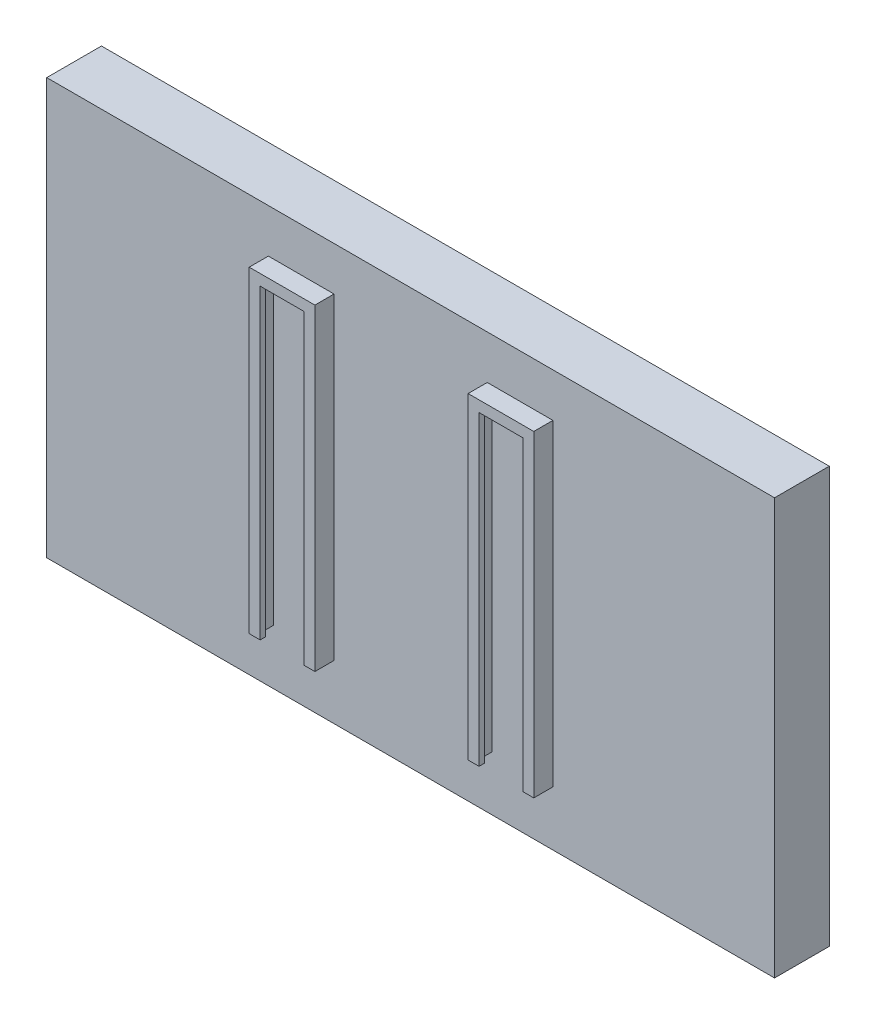
ISO-10303-21;
HEADER;
FILE_DESCRIPTION(('STEP AP214'),'2;1');
FILE_NAME('part.step','',(''),(''),'','','');
FILE_SCHEMA(('AUTOMOTIVE_DESIGN { 1 0 10303 214 1 1 1 1 }'));
ENDSEC;
DATA;
#1=APPLICATION_CONTEXT('core data for automotive mechanical design processes');
#2=APPLICATION_PROTOCOL_DEFINITION('international standard','automotive_design',2000,#1);
#3=PRODUCT_CONTEXT('',#1,'mechanical');
#4=PRODUCT('Part','Part','',(#3));
#5=PRODUCT_RELATED_PRODUCT_CATEGORY('part','',(#4));
#6=PRODUCT_DEFINITION_FORMATION('','',#4);
#7=PRODUCT_DEFINITION_CONTEXT('part definition',#1,'design');
#8=PRODUCT_DEFINITION('design','',#6,#7);
#9=PRODUCT_DEFINITION_SHAPE('','',#8);
#10=(LENGTH_UNIT() NAMED_UNIT(*) SI_UNIT(.MILLI.,.METRE.));
#11=(NAMED_UNIT(*) PLANE_ANGLE_UNIT() SI_UNIT($,.RADIAN.));
#12=(NAMED_UNIT(*) SI_UNIT($,.STERADIAN.) SOLID_ANGLE_UNIT());
#13=UNCERTAINTY_MEASURE_WITH_UNIT(LENGTH_MEASURE(1.E-05),#10,'distance_accuracy_value','');
#14=(GEOMETRIC_REPRESENTATION_CONTEXT(3) GLOBAL_UNCERTAINTY_ASSIGNED_CONTEXT((#13)) GLOBAL_UNIT_ASSIGNED_CONTEXT((#10,
#11,#12)) REPRESENTATION_CONTEXT('',''));
#15=CARTESIAN_POINT('',(0.,0.,0.));
#16=DIRECTION('',(0.,0.,1.));
#17=DIRECTION('',(1.,0.,0.));
#18=AXIS2_PLACEMENT_3D('',#15,#16,#17);
#19=CARTESIAN_POINT('',(0.,0.,10.));
#20=DIRECTION('',(0.,0.,1.));
#21=DIRECTION('',(1.,0.,0.));
#22=AXIS2_PLACEMENT_3D('',#19,#20,#21);
#23=PLANE('',#22);
#24=DIRECTION('',(0.,-1.,0.));
#25=VECTOR('',#24,1.);
#26=CARTESIAN_POINT('',(25.1,66.,10.));
#27=LINE('',#26,#25);
#28=CARTESIAN_POINT('',(25.1,66.,10.));
#29=VERTEX_POINT('',#28);
#30=CARTESIAN_POINT('',(25.1,10.,10.));
#31=VERTEX_POINT('',#30);
#32=EDGE_CURVE('E48',#29,#31,#27,.T.);
#33=ORIENTED_EDGE('',*,*,#32,.F.);
#34=DIRECTION('',(-1.,0.,0.));
#35=VECTOR('',#34,1.);
#36=CARTESIAN_POINT('',(0.,66.,10.));
#37=LINE('',#36,#35);
#38=CARTESIAN_POINT('',(14.9,66.,10.));
#39=VERTEX_POINT('',#38);
#40=EDGE_CURVE('E347',#29,#39,#37,.T.);
#41=ORIENTED_EDGE('',*,*,#40,.T.);
#42=DIRECTION('',(0.,1.,0.));
#43=VECTOR('',#42,1.);
#44=CARTESIAN_POINT('',(14.9,66.,10.));
#45=LINE('',#44,#43);
#46=CARTESIAN_POINT('',(14.9,10.,9.99999999999999));
#47=VERTEX_POINT('',#46);
#48=EDGE_CURVE('E277',#47,#39,#45,.T.);
#49=ORIENTED_EDGE('',*,*,#48,.F.);
#50=DIRECTION('',(-1.,0.,0.));
#51=VECTOR('',#50,1.);
#52=CARTESIAN_POINT('',(0.,10.,10.));
#53=LINE('',#52,#51);
#54=CARTESIAN_POINT('',(14.,10.,10.));
#55=VERTEX_POINT('',#54);
#56=EDGE_CURVE('E322',#47,#55,#53,.T.);
#57=ORIENTED_EDGE('',*,*,#56,.T.);
#58=DIRECTION('',(0.,-1.,0.));
#59=VECTOR('',#58,1.);
#60=CARTESIAN_POINT('',(14.,0.,10.));
#61=LINE('',#60,#59);
#62=CARTESIAN_POINT('',(14.,68.,10.));
#63=VERTEX_POINT('',#62);
#64=EDGE_CURVE('E328',#63,#55,#61,.T.);
#65=ORIENTED_EDGE('',*,*,#64,.F.);
#66=DIRECTION('',(-1.,0.,0.));
#67=VECTOR('',#66,1.);
#68=CARTESIAN_POINT('',(0.,68.,10.));
#69=LINE('',#68,#67);
#70=CARTESIAN_POINT('',(26.,68.,10.));
#71=VERTEX_POINT('',#70);
#72=EDGE_CURVE('E353',#71,#63,#69,.T.);
#73=ORIENTED_EDGE('',*,*,#72,.F.);
#74=DIRECTION('',(0.,1.,0.));
#75=VECTOR('',#74,1.);
#76=CARTESIAN_POINT('',(26.,0.,10.));
#77=LINE('',#76,#75);
#78=CARTESIAN_POINT('',(26.,10.,10.));
#79=VERTEX_POINT('',#78);
#80=EDGE_CURVE('E351',#79,#71,#77,.T.);
#81=ORIENTED_EDGE('',*,*,#80,.F.);
#82=DIRECTION('',(-1.,0.,0.));
#83=VECTOR('',#82,1.);
#84=CARTESIAN_POINT('',(0.,10.,10.));
#85=LINE('',#84,#83);
#86=EDGE_CURVE('E349',#79,#31,#85,.T.);
#87=ORIENTED_EDGE('',*,*,#86,.T.);
#88=EDGE_LOOP('',(#33,#41,#49,#57,#65,#73,#81,#87));
#89=FACE_BOUND('',#88,.T.);
#90=DIRECTION('',(0.,-1.,0.));
#91=VECTOR('',#90,1.);
#92=CARTESIAN_POINT('',(-66.5,76.,10.));
#93=LINE('',#92,#91);
#94=CARTESIAN_POINT('',(-66.5,76.,10.));
#95=VERTEX_POINT('',#94);
#96=CARTESIAN_POINT('',(-66.5,0.,10.));
#97=VERTEX_POINT('',#96);
#98=EDGE_CURVE('E466',#95,#97,#93,.T.);
#99=ORIENTED_EDGE('',*,*,#98,.T.);
#100=DIRECTION('',(1.,0.,0.));
#101=VECTOR('',#100,1.);
#102=CARTESIAN_POINT('',(-66.5,0.,10.));
#103=LINE('',#102,#101);
#104=CARTESIAN_POINT('',(66.5,0.,10.));
#105=VERTEX_POINT('',#104);
#106=EDGE_CURVE('E469',#97,#105,#103,.T.);
#107=ORIENTED_EDGE('',*,*,#106,.T.);
#108=DIRECTION('',(0.,1.,0.));
#109=VECTOR('',#108,1.);
#110=CARTESIAN_POINT('',(66.5,76.,10.));
#111=LINE('',#110,#109);
#112=CARTESIAN_POINT('',(66.5,76.,10.));
#113=VERTEX_POINT('',#112);
#114=EDGE_CURVE('E472',#105,#113,#111,.T.);
#115=ORIENTED_EDGE('',*,*,#114,.T.);
#116=DIRECTION('',(-1.,0.,0.));
#117=VECTOR('',#116,1.);
#118=CARTESIAN_POINT('',(-66.5,76.,10.));
#119=LINE('',#118,#117);
#120=EDGE_CURVE('E474',#113,#95,#119,.T.);
#121=ORIENTED_EDGE('',*,*,#120,.T.);
#122=EDGE_LOOP('',(#99,#107,#115,#121));
#123=FACE_BOUND('',#122,.T.);
#124=DIRECTION('',(0.,-1.,0.));
#125=VECTOR('',#124,1.);
#126=CARTESIAN_POINT('',(-14.9,66.,10.));
#127=LINE('',#126,#125);
#128=CARTESIAN_POINT('',(-14.9,66.,10.));
#129=VERTEX_POINT('',#128);
#130=CARTESIAN_POINT('',(-14.9,10.,10.));
#131=VERTEX_POINT('',#130);
#132=EDGE_CURVE('E56',#129,#131,#127,.T.);
#133=ORIENTED_EDGE('',*,*,#132,.F.);
#134=DIRECTION('',(1.,0.,0.));
#135=VECTOR('',#134,1.);
#136=CARTESIAN_POINT('',(0.,66.,10.));
#137=LINE('',#136,#135);
#138=CARTESIAN_POINT('',(-25.1,66.,10.));
#139=VERTEX_POINT('',#138);
#140=EDGE_CURVE('E377',#139,#129,#137,.T.);
#141=ORIENTED_EDGE('',*,*,#140,.F.);
#142=DIRECTION('',(0.,1.,0.));
#143=VECTOR('',#142,1.);
#144=CARTESIAN_POINT('',(-25.1,66.,10.));
#145=LINE('',#144,#143);
#146=CARTESIAN_POINT('',(-25.1,10.,9.99999999999999));
#147=VERTEX_POINT('',#146);
#148=EDGE_CURVE('E305',#147,#139,#145,.T.);
#149=ORIENTED_EDGE('',*,*,#148,.F.);
#150=DIRECTION('',(1.,0.,0.));
#151=VECTOR('',#150,1.);
#152=CARTESIAN_POINT('',(0.,10.,10.));
#153=LINE('',#152,#151);
#154=CARTESIAN_POINT('',(-26.,10.,10.));
#155=VERTEX_POINT('',#154);
#156=EDGE_CURVE('E382',#155,#147,#153,.T.);
#157=ORIENTED_EDGE('',*,*,#156,.F.);
#158=DIRECTION('',(0.,1.,0.));
#159=VECTOR('',#158,1.);
#160=CARTESIAN_POINT('',(-26.,0.,10.));
#161=LINE('',#160,#159);
#162=CARTESIAN_POINT('',(-26.,68.,10.));
#163=VERTEX_POINT('',#162);
#164=EDGE_CURVE('E408',#155,#163,#161,.T.);
#165=ORIENTED_EDGE('',*,*,#164,.T.);
#166=DIRECTION('',(1.,0.,0.));
#167=VECTOR('',#166,1.);
#168=CARTESIAN_POINT('',(0.,68.,10.));
#169=LINE('',#168,#167);
#170=CARTESIAN_POINT('',(-14.,68.,10.));
#171=VERTEX_POINT('',#170);
#172=EDGE_CURVE('E405',#163,#171,#169,.T.);
#173=ORIENTED_EDGE('',*,*,#172,.T.);
#174=DIRECTION('',(0.,1.,0.));
#175=VECTOR('',#174,1.);
#176=CARTESIAN_POINT('',(-14.,0.,10.));
#177=LINE('',#176,#175);
#178=CARTESIAN_POINT('',(-14.,10.,10.));
#179=VERTEX_POINT('',#178);
#180=EDGE_CURVE('E402',#179,#171,#177,.T.);
#181=ORIENTED_EDGE('',*,*,#180,.F.);
#182=DIRECTION('',(1.,0.,0.));
#183=VECTOR('',#182,1.);
#184=CARTESIAN_POINT('',(0.,10.,10.));
#185=LINE('',#184,#183);
#186=EDGE_CURVE('E400',#131,#179,#185,.T.);
#187=ORIENTED_EDGE('',*,*,#186,.F.);
#188=EDGE_LOOP('',(#133,#141,#149,#157,#165,#173,#181,#187));
#189=FACE_BOUND('',#188,.T.);
#190=ADVANCED_FACE('F33',(#89,#123,#189),#23,.T.);
#191=CARTESIAN_POINT('',(-66.5,76.,10.));
#192=DIRECTION('',(1.,0.,0.));
#193=DIRECTION('',(0.,0.,-1.));
#194=AXIS2_PLACEMENT_3D('',#191,#192,#193);
#195=PLANE('',#194);
#196=DIRECTION('',(0.,-1.,0.));
#197=VECTOR('',#196,1.);
#198=CARTESIAN_POINT('',(-66.5,76.,0.));
#199=LINE('',#198,#197);
#200=CARTESIAN_POINT('',(-66.5,76.,0.));
#201=VERTEX_POINT('',#200);
#202=CARTESIAN_POINT('',(-66.5,0.,0.));
#203=VERTEX_POINT('',#202);
#204=EDGE_CURVE('E459',#201,#203,#199,.T.);
#205=ORIENTED_EDGE('',*,*,#204,.T.);
#206=DIRECTION('',(0.,0.,-1.));
#207=VECTOR('',#206,1.);
#208=CARTESIAN_POINT('',(-66.5,0.,10.));
#209=LINE('',#208,#207);
#210=EDGE_CURVE('E11',#97,#203,#209,.T.);
#211=ORIENTED_EDGE('',*,*,#210,.F.);
#212=ORIENTED_EDGE('',*,*,#98,.F.);
#213=DIRECTION('',(0.,0.,-1.));
#214=VECTOR('',#213,1.);
#215=CARTESIAN_POINT('',(-66.5,76.,10.));
#216=LINE('',#215,#214);
#217=EDGE_CURVE('E476',#95,#201,#216,.T.);
#218=ORIENTED_EDGE('',*,*,#217,.T.);
#219=EDGE_LOOP('',(#205,#211,#212,#218));
#220=FACE_BOUND('',#219,.T.);
#221=ADVANCED_FACE('F35',(#220),#195,.F.);
#222=CARTESIAN_POINT('',(-66.5,0.,10.));
#223=DIRECTION('',(0.,1.,0.));
#224=DIRECTION('',(0.,0.,1.));
#225=AXIS2_PLACEMENT_3D('',#222,#223,#224);
#226=PLANE('',#225);
#227=DIRECTION('',(1.,0.,0.));
#228=VECTOR('',#227,1.);
#229=CARTESIAN_POINT('',(-66.5,0.,0.));
#230=LINE('',#229,#228);
#231=CARTESIAN_POINT('',(66.5,0.,0.));
#232=VERTEX_POINT('',#231);
#233=EDGE_CURVE('E479',#203,#232,#230,.T.);
#234=ORIENTED_EDGE('',*,*,#233,.T.);
#235=DIRECTION('',(0.,0.,-1.));
#236=VECTOR('',#235,1.);
#237=CARTESIAN_POINT('',(66.5,0.,10.));
#238=LINE('',#237,#236);
#239=EDGE_CURVE('E41',#105,#232,#238,.T.);
#240=ORIENTED_EDGE('',*,*,#239,.F.);
#241=ORIENTED_EDGE('',*,*,#106,.F.);
#242=ORIENTED_EDGE('',*,*,#210,.T.);
#243=EDGE_LOOP('',(#234,#240,#241,#242));
#244=FACE_BOUND('',#243,.T.);
#245=ADVANCED_FACE('F509',(#244),#226,.F.);
#246=CARTESIAN_POINT('',(66.5,76.,10.));
#247=DIRECTION('',(-1.,0.,0.));
#248=DIRECTION('',(0.,-1.,0.));
#249=AXIS2_PLACEMENT_3D('',#246,#247,#248);
#250=PLANE('',#249);
#251=DIRECTION('',(0.,1.,0.));
#252=VECTOR('',#251,1.);
#253=CARTESIAN_POINT('',(66.5,76.,0.));
#254=LINE('',#253,#252);
#255=CARTESIAN_POINT('',(66.5,76.,0.));
#256=VERTEX_POINT('',#255);
#257=EDGE_CURVE('E481',#232,#256,#254,.T.);
#258=ORIENTED_EDGE('',*,*,#257,.T.);
#259=DIRECTION('',(0.,0.,-1.));
#260=VECTOR('',#259,1.);
#261=CARTESIAN_POINT('',(66.5,76.,10.));
#262=LINE('',#261,#260);
#263=EDGE_CURVE('E486',#113,#256,#262,.T.);
#264=ORIENTED_EDGE('',*,*,#263,.F.);
#265=ORIENTED_EDGE('',*,*,#114,.F.);
#266=ORIENTED_EDGE('',*,*,#239,.T.);
#267=EDGE_LOOP('',(#258,#264,#265,#266));
#268=FACE_BOUND('',#267,.T.);
#269=ADVANCED_FACE('F493',(#268),#250,.F.);
#270=CARTESIAN_POINT('',(-66.5,76.,10.));
#271=DIRECTION('',(0.,-1.,0.));
#272=DIRECTION('',(1.,0.,0.));
#273=AXIS2_PLACEMENT_3D('',#270,#271,#272);
#274=PLANE('',#273);
#275=DIRECTION('',(-1.,0.,0.));
#276=VECTOR('',#275,1.);
#277=CARTESIAN_POINT('',(-66.5,76.,0.));
#278=LINE('',#277,#276);
#279=EDGE_CURVE('E470',#256,#201,#278,.T.);
#280=ORIENTED_EDGE('',*,*,#279,.T.);
#281=ORIENTED_EDGE('',*,*,#217,.F.);
#282=ORIENTED_EDGE('',*,*,#120,.F.);
#283=ORIENTED_EDGE('',*,*,#263,.T.);
#284=EDGE_LOOP('',(#280,#281,#282,#283));
#285=FACE_BOUND('',#284,.T.);
#286=ADVANCED_FACE('F502',(#285),#274,.F.);
#287=CARTESIAN_POINT('',(0.,0.,0.));
#288=DIRECTION('',(0.,0.,1.));
#289=DIRECTION('',(1.,0.,0.));
#290=AXIS2_PLACEMENT_3D('',#287,#288,#289);
#291=PLANE('',#290);
#292=DIRECTION('',(-1.,0.,0.));
#293=VECTOR('',#292,1.);
#294=CARTESIAN_POINT('',(55.,5.49999999999998,0.));
#295=LINE('',#294,#293);
#296=CARTESIAN_POINT('',(55.,5.49999999999998,0.));
#297=VERTEX_POINT('',#296);
#298=CARTESIAN_POINT('',(-55.,5.49999999999998,0.));
#299=VERTEX_POINT('',#298);
#300=EDGE_CURVE('E449',#297,#299,#295,.T.);
#301=ORIENTED_EDGE('',*,*,#300,.F.);
#302=DIRECTION('',(0.,-1.,0.));
#303=VECTOR('',#302,1.);
#304=CARTESIAN_POINT('',(55.,70.5,0.));
#305=LINE('',#304,#303);
#306=CARTESIAN_POINT('',(55.,70.5,0.));
#307=VERTEX_POINT('',#306);
#308=EDGE_CURVE('E433',#307,#297,#305,.T.);
#309=ORIENTED_EDGE('',*,*,#308,.F.);
#310=DIRECTION('',(1.,0.,0.));
#311=VECTOR('',#310,1.);
#312=CARTESIAN_POINT('',(55.,70.5,0.));
#313=LINE('',#312,#311);
#314=CARTESIAN_POINT('',(-55.,70.5,0.));
#315=VERTEX_POINT('',#314);
#316=EDGE_CURVE('E438',#315,#307,#313,.T.);
#317=ORIENTED_EDGE('',*,*,#316,.F.);
#318=DIRECTION('',(0.,1.,0.));
#319=VECTOR('',#318,1.);
#320=CARTESIAN_POINT('',(-55.,70.5,0.));
#321=LINE('',#320,#319);
#322=EDGE_CURVE('E452',#299,#315,#321,.T.);
#323=ORIENTED_EDGE('',*,*,#322,.F.);
#324=EDGE_LOOP('',(#301,#309,#317,#323));
#325=FACE_BOUND('',#324,.T.);
#326=ORIENTED_EDGE('',*,*,#204,.F.);
#327=ORIENTED_EDGE('',*,*,#279,.F.);
#328=ORIENTED_EDGE('',*,*,#257,.F.);
#329=ORIENTED_EDGE('',*,*,#233,.F.);
#330=EDGE_LOOP('',(#326,#327,#328,#329));
#331=FACE_BOUND('',#330,.T.);
#332=ADVANCED_FACE('F499',(#325,#331),#291,.F.);
#333=CARTESIAN_POINT('',(55.,70.5,2.));
#334=DIRECTION('',(1.,0.,0.));
#335=DIRECTION('',(0.,1.,0.));
#336=AXIS2_PLACEMENT_3D('',#333,#334,#335);
#337=PLANE('',#336);
#338=ORIENTED_EDGE('',*,*,#308,.T.);
#339=DIRECTION('',(0.,0.,-1.));
#340=VECTOR('',#339,1.);
#341=CARTESIAN_POINT('',(55.,5.49999999999998,2.));
#342=LINE('',#341,#340);
#343=CARTESIAN_POINT('',(55.,5.49999999999998,2.));
#344=VERTEX_POINT('',#343);
#345=EDGE_CURVE('E447',#344,#297,#342,.T.);
#346=ORIENTED_EDGE('',*,*,#345,.F.);
#347=DIRECTION('',(0.,-1.,0.));
#348=VECTOR('',#347,1.);
#349=CARTESIAN_POINT('',(55.,70.5,2.));
#350=LINE('',#349,#348);
#351=CARTESIAN_POINT('',(55.,70.5,2.));
#352=VERTEX_POINT('',#351);
#353=EDGE_CURVE('E434',#352,#344,#350,.T.);
#354=ORIENTED_EDGE('',*,*,#353,.F.);
#355=DIRECTION('',(0.,0.,-1.));
#356=VECTOR('',#355,1.);
#357=CARTESIAN_POINT('',(55.,70.5,2.));
#358=LINE('',#357,#356);
#359=EDGE_CURVE('E457',#352,#307,#358,.T.);
#360=ORIENTED_EDGE('',*,*,#359,.T.);
#361=EDGE_LOOP('',(#338,#346,#354,#360));
#362=FACE_BOUND('',#361,.T.);
#363=ADVANCED_FACE('F525',(#362),#337,.F.);
#364=CARTESIAN_POINT('',(55.,70.5,2.));
#365=DIRECTION('',(0.,1.,0.));
#366=DIRECTION('',(0.,0.,1.));
#367=AXIS2_PLACEMENT_3D('',#364,#365,#366);
#368=PLANE('',#367);
#369=ORIENTED_EDGE('',*,*,#316,.T.);
#370=ORIENTED_EDGE('',*,*,#359,.F.);
#371=DIRECTION('',(1.,0.,0.));
#372=VECTOR('',#371,1.);
#373=CARTESIAN_POINT('',(55.,70.5,2.));
#374=LINE('',#373,#372);
#375=CARTESIAN_POINT('',(-55.,70.5,2.));
#376=VERTEX_POINT('',#375);
#377=EDGE_CURVE('E444',#376,#352,#374,.T.);
#378=ORIENTED_EDGE('',*,*,#377,.F.);
#379=DIRECTION('',(0.,0.,-1.));
#380=VECTOR('',#379,1.);
#381=CARTESIAN_POINT('',(-55.,70.5,2.));
#382=LINE('',#381,#380);
#383=EDGE_CURVE('E460',#376,#315,#382,.T.);
#384=ORIENTED_EDGE('',*,*,#383,.T.);
#385=EDGE_LOOP('',(#369,#370,#378,#384));
#386=FACE_BOUND('',#385,.T.);
#387=ADVANCED_FACE('F545',(#386),#368,.F.);
#388=CARTESIAN_POINT('',(-55.,70.5,2.));
#389=DIRECTION('',(-1.,0.,0.));
#390=DIRECTION('',(0.,-1.,0.));
#391=AXIS2_PLACEMENT_3D('',#388,#389,#390);
#392=PLANE('',#391);
#393=ORIENTED_EDGE('',*,*,#322,.T.);
#394=ORIENTED_EDGE('',*,*,#383,.F.);
#395=DIRECTION('',(0.,1.,0.));
#396=VECTOR('',#395,1.);
#397=CARTESIAN_POINT('',(-55.,70.5,2.));
#398=LINE('',#397,#396);
#399=CARTESIAN_POINT('',(-55.,5.49999999999998,2.));
#400=VERTEX_POINT('',#399);
#401=EDGE_CURVE('E441',#400,#376,#398,.T.);
#402=ORIENTED_EDGE('',*,*,#401,.F.);
#403=DIRECTION('',(0.,0.,-1.));
#404=VECTOR('',#403,1.);
#405=CARTESIAN_POINT('',(-55.,5.49999999999998,2.));
#406=LINE('',#405,#404);
#407=EDGE_CURVE('E462',#400,#299,#406,.T.);
#408=ORIENTED_EDGE('',*,*,#407,.T.);
#409=EDGE_LOOP('',(#393,#394,#402,#408));
#410=FACE_BOUND('',#409,.T.);
#411=ADVANCED_FACE('F552',(#410),#392,.F.);
#412=CARTESIAN_POINT('',(55.,5.49999999999998,2.));
#413=DIRECTION('',(0.,-1.,0.));
#414=DIRECTION('',(0.,0.,-1.));
#415=AXIS2_PLACEMENT_3D('',#412,#413,#414);
#416=PLANE('',#415);
#417=ORIENTED_EDGE('',*,*,#300,.T.);
#418=ORIENTED_EDGE('',*,*,#407,.F.);
#419=DIRECTION('',(-1.,0.,0.));
#420=VECTOR('',#419,1.);
#421=CARTESIAN_POINT('',(55.,5.49999999999998,2.));
#422=LINE('',#421,#420);
#423=EDGE_CURVE('E437',#344,#400,#422,.T.);
#424=ORIENTED_EDGE('',*,*,#423,.F.);
#425=ORIENTED_EDGE('',*,*,#345,.T.);
#426=EDGE_LOOP('',(#417,#418,#424,#425));
#427=FACE_BOUND('',#426,.T.);
#428=ADVANCED_FACE('F560',(#427),#416,.F.);
#429=CARTESIAN_POINT('',(0.,0.,2.));
#430=DIRECTION('',(0.,0.,-1.));
#431=DIRECTION('',(-1.,0.,0.));
#432=AXIS2_PLACEMENT_3D('',#429,#430,#431);
#433=PLANE('',#432);
#434=ORIENTED_EDGE('',*,*,#353,.T.);
#435=ORIENTED_EDGE('',*,*,#423,.T.);
#436=ORIENTED_EDGE('',*,*,#401,.T.);
#437=ORIENTED_EDGE('',*,*,#377,.T.);
#438=EDGE_LOOP('',(#434,#435,#436,#437));
#439=FACE_BOUND('',#438,.T.);
#440=ADVANCED_FACE('F567',(#439),#433,.T.);
#441=CARTESIAN_POINT('',(0.,66.,13.5));
#442=DIRECTION('',(0.,1.,0.));
#443=DIRECTION('',(0.,0.,1.));
#444=AXIS2_PLACEMENT_3D('',#441,#442,#443);
#445=PLANE('',#444);
#446=ORIENTED_EDGE('',*,*,#140,.T.);
#447=DIRECTION('',(0.,0.,-1.));
#448=VECTOR('',#447,1.);
#449=CARTESIAN_POINT('',(-14.9,66.,10.));
#450=LINE('',#449,#448);
#451=CARTESIAN_POINT('',(-14.9,66.,12.5));
#452=VERTEX_POINT('',#451);
#453=EDGE_CURVE('E296',#452,#129,#450,.T.);
#454=ORIENTED_EDGE('',*,*,#453,.F.);
#455=DIRECTION('',(-1.,0.,0.));
#456=VECTOR('',#455,1.);
#457=CARTESIAN_POINT('',(-14.9,66.,12.5));
#458=LINE('',#457,#456);
#459=CARTESIAN_POINT('',(-16.,66.,12.5));
#460=VERTEX_POINT('',#459);
#461=EDGE_CURVE('E301',#452,#460,#458,.T.);
#462=ORIENTED_EDGE('',*,*,#461,.T.);
#463=DIRECTION('',(0.,0.,-1.));
#464=VECTOR('',#463,1.);
#465=CARTESIAN_POINT('',(-16.,66.,13.5));
#466=LINE('',#465,#464);
#467=CARTESIAN_POINT('',(-16.,66.,13.5));
#468=VERTEX_POINT('',#467);
#469=EDGE_CURVE('E430',#468,#460,#466,.T.);
#470=ORIENTED_EDGE('',*,*,#469,.F.);
#471=DIRECTION('',(1.,0.,0.));
#472=VECTOR('',#471,1.);
#473=CARTESIAN_POINT('',(0.,66.,13.5));
#474=LINE('',#473,#472);
#475=CARTESIAN_POINT('',(-24.,66.,13.5));
#476=VERTEX_POINT('',#475);
#477=EDGE_CURVE('E378',#476,#468,#474,.T.);
#478=ORIENTED_EDGE('',*,*,#477,.F.);
#479=DIRECTION('',(0.,0.,-1.));
#480=VECTOR('',#479,1.);
#481=CARTESIAN_POINT('',(-24.,66.,13.5));
#482=LINE('',#481,#480);
#483=CARTESIAN_POINT('',(-24.,66.,12.5));
#484=VERTEX_POINT('',#483);
#485=EDGE_CURVE('E398',#476,#484,#482,.T.);
#486=ORIENTED_EDGE('',*,*,#485,.T.);
#487=DIRECTION('',(1.,0.,0.));
#488=VECTOR('',#487,1.);
#489=CARTESIAN_POINT('',(-25.1,66.,12.5));
#490=LINE('',#489,#488);
#491=CARTESIAN_POINT('',(-25.1,66.,12.5));
#492=VERTEX_POINT('',#491);
#493=EDGE_CURVE('E317',#492,#484,#490,.T.);
#494=ORIENTED_EDGE('',*,*,#493,.F.);
#495=DIRECTION('',(0.,0.,1.));
#496=VECTOR('',#495,1.);
#497=CARTESIAN_POINT('',(-25.1,66.,10.));
#498=LINE('',#497,#496);
#499=EDGE_CURVE('E308',#139,#492,#498,.T.);
#500=ORIENTED_EDGE('',*,*,#499,.F.);
#501=EDGE_LOOP('',(#446,#454,#462,#470,#478,#486,#494,#500));
#502=FACE_BOUND('',#501,.T.);
#503=ADVANCED_FACE('F573',(#502),#445,.F.);
#504=CARTESIAN_POINT('',(-16.,0.,13.5));
#505=DIRECTION('',(1.,0.,0.));
#506=DIRECTION('',(0.,1.,0.));
#507=AXIS2_PLACEMENT_3D('',#504,#505,#506);
#508=PLANE('',#507);
#509=ORIENTED_EDGE('',*,*,#469,.T.);
#510=DIRECTION('',(0.,1.,0.));
#511=VECTOR('',#510,1.);
#512=CARTESIAN_POINT('',(-16.,66.,12.5));
#513=LINE('',#512,#511);
#514=CARTESIAN_POINT('',(-16.,10.,12.5));
#515=VERTEX_POINT('',#514);
#516=EDGE_CURVE('E287',#515,#460,#513,.T.);
#517=ORIENTED_EDGE('',*,*,#516,.F.);
#518=DIRECTION('',(0.,0.,-1.));
#519=VECTOR('',#518,1.);
#520=CARTESIAN_POINT('',(-16.,10.,13.5));
#521=LINE('',#520,#519);
#522=CARTESIAN_POINT('',(-16.,10.,13.5));
#523=VERTEX_POINT('',#522);
#524=EDGE_CURVE('E427',#523,#515,#521,.T.);
#525=ORIENTED_EDGE('',*,*,#524,.F.);
#526=DIRECTION('',(0.,-1.,0.));
#527=VECTOR('',#526,1.);
#528=CARTESIAN_POINT('',(-16.,0.,13.5));
#529=LINE('',#528,#527);
#530=EDGE_CURVE('E381',#468,#523,#529,.T.);
#531=ORIENTED_EDGE('',*,*,#530,.F.);
#532=EDGE_LOOP('',(#509,#517,#525,#531));
#533=FACE_BOUND('',#532,.T.);
#534=ADVANCED_FACE('F724',(#533),#508,.F.);
#535=CARTESIAN_POINT('',(0.,10.,13.5));
#536=DIRECTION('',(0.,1.,0.));
#537=DIRECTION('',(0.,0.,1.));
#538=AXIS2_PLACEMENT_3D('',#535,#536,#537);
#539=PLANE('',#538);
#540=ORIENTED_EDGE('',*,*,#524,.T.);
#541=DIRECTION('',(-1.,0.,0.));
#542=VECTOR('',#541,1.);
#543=CARTESIAN_POINT('',(-14.9,10.,12.5));
#544=LINE('',#543,#542);
#545=CARTESIAN_POINT('',(-14.9,10.,12.5));
#546=VERTEX_POINT('',#545);
#547=EDGE_CURVE('E298',#546,#515,#544,.T.);
#548=ORIENTED_EDGE('',*,*,#547,.F.);
#549=DIRECTION('',(0.,0.,1.));
#550=VECTOR('',#549,1.);
#551=CARTESIAN_POINT('',(-14.9,10.,10.));
#552=LINE('',#551,#550);
#553=EDGE_CURVE('E291',#131,#546,#552,.T.);
#554=ORIENTED_EDGE('',*,*,#553,.F.);
#555=ORIENTED_EDGE('',*,*,#186,.T.);
#556=DIRECTION('',(0.,0.,-1.));
#557=VECTOR('',#556,1.);
#558=CARTESIAN_POINT('',(-14.,10.,13.5));
#559=LINE('',#558,#557);
#560=CARTESIAN_POINT('',(-14.,10.,13.5));
#561=VERTEX_POINT('',#560);
#562=EDGE_CURVE('E424',#561,#179,#559,.T.);
#563=ORIENTED_EDGE('',*,*,#562,.F.);
#564=DIRECTION('',(1.,0.,0.));
#565=VECTOR('',#564,1.);
#566=CARTESIAN_POINT('',(0.,10.,13.5));
#567=LINE('',#566,#565);
#568=EDGE_CURVE('E384',#523,#561,#567,.T.);
#569=ORIENTED_EDGE('',*,*,#568,.F.);
#570=EDGE_LOOP('',(#540,#548,#554,#555,#563,#569));
#571=FACE_BOUND('',#570,.T.);
#572=ADVANCED_FACE('F588',(#571),#539,.F.);
#573=CARTESIAN_POINT('',(-14.,0.,13.5));
#574=DIRECTION('',(-1.,0.,0.));
#575=DIRECTION('',(0.,0.,1.));
#576=AXIS2_PLACEMENT_3D('',#573,#574,#575);
#577=PLANE('',#576);
#578=ORIENTED_EDGE('',*,*,#180,.T.);
#579=DIRECTION('',(0.,0.,-1.));
#580=VECTOR('',#579,1.);
#581=CARTESIAN_POINT('',(-14.,68.,13.5));
#582=LINE('',#581,#580);
#583=CARTESIAN_POINT('',(-14.,68.,13.5));
#584=VERTEX_POINT('',#583);
#585=EDGE_CURVE('E422',#584,#171,#582,.T.);
#586=ORIENTED_EDGE('',*,*,#585,.F.);
#587=DIRECTION('',(0.,1.,0.));
#588=VECTOR('',#587,1.);
#589=CARTESIAN_POINT('',(-14.,0.,13.5));
#590=LINE('',#589,#588);
#591=EDGE_CURVE('E386',#561,#584,#590,.T.);
#592=ORIENTED_EDGE('',*,*,#591,.F.);
#593=ORIENTED_EDGE('',*,*,#562,.T.);
#594=EDGE_LOOP('',(#578,#586,#592,#593));
#595=FACE_BOUND('',#594,.T.);
#596=ADVANCED_FACE('F582',(#595),#577,.F.);
#597=CARTESIAN_POINT('',(0.,68.,13.5));
#598=DIRECTION('',(0.,1.,0.));
#599=DIRECTION('',(0.,0.,1.));
#600=AXIS2_PLACEMENT_3D('',#597,#598,#599);
#601=PLANE('',#600);
#602=ORIENTED_EDGE('',*,*,#172,.F.);
#603=DIRECTION('',(0.,0.,-1.));
#604=VECTOR('',#603,1.);
#605=CARTESIAN_POINT('',(-26.,68.,13.5));
#606=LINE('',#605,#604);
#607=CARTESIAN_POINT('',(-26.,68.,13.5));
#608=VERTEX_POINT('',#607);
#609=EDGE_CURVE('E420',#608,#163,#606,.T.);
#610=ORIENTED_EDGE('',*,*,#609,.F.);
#611=DIRECTION('',(1.,0.,0.));
#612=VECTOR('',#611,1.);
#613=CARTESIAN_POINT('',(0.,68.,13.5));
#614=LINE('',#613,#612);
#615=EDGE_CURVE('E388',#608,#584,#614,.T.);
#616=ORIENTED_EDGE('',*,*,#615,.T.);
#617=ORIENTED_EDGE('',*,*,#585,.T.);
#618=EDGE_LOOP('',(#602,#610,#616,#617));
#619=FACE_BOUND('',#618,.T.);
#620=ADVANCED_FACE('F587',(#619),#601,.T.);
#621=CARTESIAN_POINT('',(-26.,0.,13.5));
#622=DIRECTION('',(-1.,0.,0.));
#623=DIRECTION('',(0.,0.,1.));
#624=AXIS2_PLACEMENT_3D('',#621,#622,#623);
#625=PLANE('',#624);
#626=ORIENTED_EDGE('',*,*,#164,.F.);
#627=DIRECTION('',(0.,0.,-1.));
#628=VECTOR('',#627,1.);
#629=CARTESIAN_POINT('',(-26.,10.,13.5));
#630=LINE('',#629,#628);
#631=CARTESIAN_POINT('',(-26.,10.,13.5));
#632=VERTEX_POINT('',#631);
#633=EDGE_CURVE('E418',#632,#155,#630,.T.);
#634=ORIENTED_EDGE('',*,*,#633,.F.);
#635=DIRECTION('',(0.,1.,0.));
#636=VECTOR('',#635,1.);
#637=CARTESIAN_POINT('',(-26.,0.,13.5));
#638=LINE('',#637,#636);
#639=EDGE_CURVE('E391',#632,#608,#638,.T.);
#640=ORIENTED_EDGE('',*,*,#639,.T.);
#641=ORIENTED_EDGE('',*,*,#609,.T.);
#642=EDGE_LOOP('',(#626,#634,#640,#641));
#643=FACE_BOUND('',#642,.T.);
#644=ADVANCED_FACE('F600',(#643),#625,.T.);
#645=CARTESIAN_POINT('',(0.,10.,13.5));
#646=DIRECTION('',(0.,1.,0.));
#647=DIRECTION('',(0.,0.,1.));
#648=AXIS2_PLACEMENT_3D('',#645,#646,#647);
#649=PLANE('',#648);
#650=DIRECTION('',(0.,0.,-1.));
#651=VECTOR('',#650,1.);
#652=CARTESIAN_POINT('',(-25.1,10.,9.99999999999999));
#653=LINE('',#652,#651);
#654=CARTESIAN_POINT('',(-25.1,10.,12.5));
#655=VERTEX_POINT('',#654);
#656=EDGE_CURVE('E314',#655,#147,#653,.T.);
#657=ORIENTED_EDGE('',*,*,#656,.F.);
#658=DIRECTION('',(1.,0.,0.));
#659=VECTOR('',#658,1.);
#660=CARTESIAN_POINT('',(-25.1,10.,12.5));
#661=LINE('',#660,#659);
#662=CARTESIAN_POINT('',(-24.,10.,12.5));
#663=VERTEX_POINT('',#662);
#664=EDGE_CURVE('E319',#655,#663,#661,.T.);
#665=ORIENTED_EDGE('',*,*,#664,.T.);
#666=DIRECTION('',(0.,0.,-1.));
#667=VECTOR('',#666,1.);
#668=CARTESIAN_POINT('',(-24.,10.,13.5));
#669=LINE('',#668,#667);
#670=CARTESIAN_POINT('',(-24.,10.,13.5));
#671=VERTEX_POINT('',#670);
#672=EDGE_CURVE('E415',#671,#663,#669,.T.);
#673=ORIENTED_EDGE('',*,*,#672,.F.);
#674=DIRECTION('',(1.,0.,0.));
#675=VECTOR('',#674,1.);
#676=CARTESIAN_POINT('',(0.,10.,13.5));
#677=LINE('',#676,#675);
#678=EDGE_CURVE('E394',#632,#671,#677,.T.);
#679=ORIENTED_EDGE('',*,*,#678,.F.);
#680=ORIENTED_EDGE('',*,*,#633,.T.);
#681=ORIENTED_EDGE('',*,*,#156,.T.);
#682=EDGE_LOOP('',(#657,#665,#673,#679,#680,#681));
#683=FACE_BOUND('',#682,.T.);
#684=ADVANCED_FACE('F611',(#683),#649,.F.);
#685=CARTESIAN_POINT('',(-24.,0.,13.5));
#686=DIRECTION('',(-1.,0.,0.));
#687=DIRECTION('',(0.,0.,1.));
#688=AXIS2_PLACEMENT_3D('',#685,#686,#687);
#689=PLANE('',#688);
#690=ORIENTED_EDGE('',*,*,#672,.T.);
#691=DIRECTION('',(0.,-1.,0.));
#692=VECTOR('',#691,1.);
#693=CARTESIAN_POINT('',(-24.,66.,12.5));
#694=LINE('',#693,#692);
#695=EDGE_CURVE('E303',#484,#663,#694,.T.);
#696=ORIENTED_EDGE('',*,*,#695,.F.);
#697=ORIENTED_EDGE('',*,*,#485,.F.);
#698=DIRECTION('',(0.,1.,0.));
#699=VECTOR('',#698,1.);
#700=CARTESIAN_POINT('',(-24.,0.,13.5));
#701=LINE('',#700,#699);
#702=EDGE_CURVE('E396',#671,#476,#701,.T.);
#703=ORIENTED_EDGE('',*,*,#702,.F.);
#704=EDGE_LOOP('',(#690,#696,#697,#703));
#705=FACE_BOUND('',#704,.T.);
#706=ADVANCED_FACE('F625',(#705),#689,.F.);
#707=CARTESIAN_POINT('',(0.,0.,13.5));
#708=DIRECTION('',(0.,0.,1.));
#709=DIRECTION('',(1.,0.,0.));
#710=AXIS2_PLACEMENT_3D('',#707,#708,#709);
#711=PLANE('',#710);
#712=ORIENTED_EDGE('',*,*,#477,.T.);
#713=ORIENTED_EDGE('',*,*,#530,.T.);
#714=ORIENTED_EDGE('',*,*,#568,.T.);
#715=ORIENTED_EDGE('',*,*,#591,.T.);
#716=ORIENTED_EDGE('',*,*,#615,.F.);
#717=ORIENTED_EDGE('',*,*,#639,.F.);
#718=ORIENTED_EDGE('',*,*,#678,.T.);
#719=ORIENTED_EDGE('',*,*,#702,.T.);
#720=EDGE_LOOP('',(#712,#713,#714,#715,#716,#717,#718,#719));
#721=FACE_BOUND('',#720,.T.);
#722=ADVANCED_FACE('F619',(#721),#711,.T.);
#723=CARTESIAN_POINT('',(0.,10.,13.5));
#724=DIRECTION('',(0.,-1.,0.));
#725=DIRECTION('',(0.,0.,-1.));
#726=AXIS2_PLACEMENT_3D('',#723,#724,#725);
#727=PLANE('',#726);
#728=DIRECTION('',(1.,0.,0.));
#729=VECTOR('',#728,1.);
#730=CARTESIAN_POINT('',(14.9,10.,12.5));
#731=LINE('',#730,#729);
#732=CARTESIAN_POINT('',(14.9,10.,12.5));
#733=VERTEX_POINT('',#732);
#734=CARTESIAN_POINT('',(16.,10.,12.5));
#735=VERTEX_POINT('',#734);
#736=EDGE_CURVE('E283',#733,#735,#731,.T.);
#737=ORIENTED_EDGE('',*,*,#736,.T.);
#738=DIRECTION('',(0.,0.,-1.));
#739=VECTOR('',#738,1.);
#740=CARTESIAN_POINT('',(16.,10.,13.5));
#741=LINE('',#740,#739);
#742=CARTESIAN_POINT('',(16.,10.,13.5));
#743=VERTEX_POINT('',#742);
#744=EDGE_CURVE('E374',#743,#735,#741,.T.);
#745=ORIENTED_EDGE('',*,*,#744,.F.);
#746=DIRECTION('',(-1.,0.,0.));
#747=VECTOR('',#746,1.);
#748=CARTESIAN_POINT('',(0.,10.,13.5));
#749=LINE('',#748,#747);
#750=CARTESIAN_POINT('',(14.,10.,13.5));
#751=VERTEX_POINT('',#750);
#752=EDGE_CURVE('E324',#743,#751,#749,.T.);
#753=ORIENTED_EDGE('',*,*,#752,.T.);
#754=DIRECTION('',(0.,0.,-1.));
#755=VECTOR('',#754,1.);
#756=CARTESIAN_POINT('',(14.,10.,13.5));
#757=LINE('',#756,#755);
#758=EDGE_CURVE('E345',#751,#55,#757,.T.);
#759=ORIENTED_EDGE('',*,*,#758,.T.);
#760=ORIENTED_EDGE('',*,*,#56,.F.);
#761=DIRECTION('',(0.,0.,-1.));
#762=VECTOR('',#761,1.);
#763=CARTESIAN_POINT('',(14.9,10.,12.5));
#764=LINE('',#763,#762);
#765=EDGE_CURVE('E274',#733,#47,#764,.T.);
#766=ORIENTED_EDGE('',*,*,#765,.F.);
#767=EDGE_LOOP('',(#737,#745,#753,#759,#760,#766));
#768=FACE_BOUND('',#767,.T.);
#769=ADVANCED_FACE('F624',(#768),#727,.T.);
#770=CARTESIAN_POINT('',(16.,0.,13.5));
#771=DIRECTION('',(1.,0.,0.));
#772=DIRECTION('',(0.,1.,0.));
#773=AXIS2_PLACEMENT_3D('',#770,#771,#772);
#774=PLANE('',#773);
#775=DIRECTION('',(0.,-1.,0.));
#776=VECTOR('',#775,1.);
#777=CARTESIAN_POINT('',(16.,66.,12.5));
#778=LINE('',#777,#776);
#779=CARTESIAN_POINT('',(16.,66.,12.5));
#780=VERTEX_POINT('',#779);
#781=EDGE_CURVE('E266',#780,#735,#778,.T.);
#782=ORIENTED_EDGE('',*,*,#781,.F.);
#783=DIRECTION('',(0.,0.,-1.));
#784=VECTOR('',#783,1.);
#785=CARTESIAN_POINT('',(16.,66.,13.5));
#786=LINE('',#785,#784);
#787=CARTESIAN_POINT('',(16.,66.,13.5));
#788=VERTEX_POINT('',#787);
#789=EDGE_CURVE('E371',#788,#780,#786,.T.);
#790=ORIENTED_EDGE('',*,*,#789,.F.);
#791=DIRECTION('',(0.,-1.,0.));
#792=VECTOR('',#791,1.);
#793=CARTESIAN_POINT('',(16.,0.,13.5));
#794=LINE('',#793,#792);
#795=EDGE_CURVE('E327',#788,#743,#794,.T.);
#796=ORIENTED_EDGE('',*,*,#795,.T.);
#797=ORIENTED_EDGE('',*,*,#744,.T.);
#798=EDGE_LOOP('',(#782,#790,#796,#797));
#799=FACE_BOUND('',#798,.T.);
#800=ADVANCED_FACE('F770',(#799),#774,.T.);
#801=CARTESIAN_POINT('',(0.,66.,13.5));
#802=DIRECTION('',(0.,-1.,0.));
#803=DIRECTION('',(0.,0.,-1.));
#804=AXIS2_PLACEMENT_3D('',#801,#802,#803);
#805=PLANE('',#804);
#806=ORIENTED_EDGE('',*,*,#40,.F.);
#807=DIRECTION('',(0.,0.,-1.));
#808=VECTOR('',#807,1.);
#809=CARTESIAN_POINT('',(25.1,66.,10.));
#810=LINE('',#809,#808);
#811=CARTESIAN_POINT('',(25.1,66.,12.5));
#812=VERTEX_POINT('',#811);
#813=EDGE_CURVE('E253',#812,#29,#810,.T.);
#814=ORIENTED_EDGE('',*,*,#813,.F.);
#815=DIRECTION('',(-1.,0.,0.));
#816=VECTOR('',#815,1.);
#817=CARTESIAN_POINT('',(25.1,66.,12.5));
#818=LINE('',#817,#816);
#819=CARTESIAN_POINT('',(24.,66.,12.5));
#820=VERTEX_POINT('',#819);
#821=EDGE_CURVE('E251',#812,#820,#818,.T.);
#822=ORIENTED_EDGE('',*,*,#821,.T.);
#823=DIRECTION('',(0.,0.,-1.));
#824=VECTOR('',#823,1.);
#825=CARTESIAN_POINT('',(24.,66.,13.5));
#826=LINE('',#825,#824);
#827=CARTESIAN_POINT('',(24.,66.,13.5));
#828=VERTEX_POINT('',#827);
#829=EDGE_CURVE('E368',#828,#820,#826,.T.);
#830=ORIENTED_EDGE('',*,*,#829,.F.);
#831=DIRECTION('',(-1.,0.,0.));
#832=VECTOR('',#831,1.);
#833=CARTESIAN_POINT('',(0.,66.,13.5));
#834=LINE('',#833,#832);
#835=EDGE_CURVE('E331',#828,#788,#834,.T.);
#836=ORIENTED_EDGE('',*,*,#835,.T.);
#837=ORIENTED_EDGE('',*,*,#789,.T.);
#838=DIRECTION('',(1.,0.,0.));
#839=VECTOR('',#838,1.);
#840=CARTESIAN_POINT('',(14.9,66.,12.5));
#841=LINE('',#840,#839);
#842=CARTESIAN_POINT('',(14.9,66.,12.5));
#843=VERTEX_POINT('',#842);
#844=EDGE_CURVE('E285',#843,#780,#841,.T.);
#845=ORIENTED_EDGE('',*,*,#844,.F.);
#846=DIRECTION('',(0.,0.,1.));
#847=VECTOR('',#846,1.);
#848=CARTESIAN_POINT('',(14.9,66.,12.5));
#849=LINE('',#848,#847);
#850=EDGE_CURVE('E280',#39,#843,#849,.T.);
#851=ORIENTED_EDGE('',*,*,#850,.F.);
#852=EDGE_LOOP('',(#806,#814,#822,#830,#836,#837,#845,#851));
#853=FACE_BOUND('',#852,.T.);
#854=ADVANCED_FACE('F780',(#853),#805,.T.);
#855=CARTESIAN_POINT('',(24.,0.,13.5));
#856=DIRECTION('',(-1.,0.,0.));
#857=DIRECTION('',(0.,0.,1.));
#858=AXIS2_PLACEMENT_3D('',#855,#856,#857);
#859=PLANE('',#858);
#860=DIRECTION('',(0.,1.,0.));
#861=VECTOR('',#860,1.);
#862=CARTESIAN_POINT('',(24.,66.,12.5));
#863=LINE('',#862,#861);
#864=CARTESIAN_POINT('',(24.,10.,12.5));
#865=VERTEX_POINT('',#864);
#866=EDGE_CURVE('E881',#865,#820,#863,.T.);
#867=ORIENTED_EDGE('',*,*,#866,.F.);
#868=DIRECTION('',(0.,0.,-1.));
#869=VECTOR('',#868,1.);
#870=CARTESIAN_POINT('',(24.,10.,13.5));
#871=LINE('',#870,#869);
#872=CARTESIAN_POINT('',(24.,10.,13.5));
#873=VERTEX_POINT('',#872);
#874=EDGE_CURVE('E264',#873,#865,#871,.T.);
#875=ORIENTED_EDGE('',*,*,#874,.F.);
#876=DIRECTION('',(0.,1.,0.));
#877=VECTOR('',#876,1.);
#878=CARTESIAN_POINT('',(24.,0.,13.5));
#879=LINE('',#878,#877);
#880=EDGE_CURVE('E334',#873,#828,#879,.T.);
#881=ORIENTED_EDGE('',*,*,#880,.T.);
#882=ORIENTED_EDGE('',*,*,#829,.T.);
#883=EDGE_LOOP('',(#867,#875,#881,#882));
#884=FACE_BOUND('',#883,.T.);
#885=ADVANCED_FACE('F815',(#884),#859,.T.);
#886=CARTESIAN_POINT('',(0.,10.,13.5));
#887=DIRECTION('',(0.,-1.,0.));
#888=DIRECTION('',(0.,0.,-1.));
#889=AXIS2_PLACEMENT_3D('',#886,#887,#888);
#890=PLANE('',#889);
#891=DIRECTION('',(-1.,0.,0.));
#892=VECTOR('',#891,1.);
#893=CARTESIAN_POINT('',(25.1,10.,12.5));
#894=LINE('',#893,#892);
#895=CARTESIAN_POINT('',(25.1,10.,12.5));
#896=VERTEX_POINT('',#895);
#897=EDGE_CURVE('E249',#896,#865,#894,.T.);
#898=ORIENTED_EDGE('',*,*,#897,.F.);
#899=DIRECTION('',(0.,0.,1.));
#900=VECTOR('',#899,1.);
#901=CARTESIAN_POINT('',(25.1,10.,10.));
#902=LINE('',#901,#900);
#903=EDGE_CURVE('E254',#31,#896,#902,.T.);
#904=ORIENTED_EDGE('',*,*,#903,.F.);
#905=ORIENTED_EDGE('',*,*,#86,.F.);
#906=DIRECTION('',(0.,0.,-1.));
#907=VECTOR('',#906,1.);
#908=CARTESIAN_POINT('',(26.,10.,13.5));
#909=LINE('',#908,#907);
#910=CARTESIAN_POINT('',(26.,10.,13.5));
#911=VERTEX_POINT('',#910);
#912=EDGE_CURVE('E365',#911,#79,#909,.T.);
#913=ORIENTED_EDGE('',*,*,#912,.F.);
#914=DIRECTION('',(-1.,0.,0.));
#915=VECTOR('',#914,1.);
#916=CARTESIAN_POINT('',(0.,10.,13.5));
#917=LINE('',#916,#915);
#918=EDGE_CURVE('E337',#911,#873,#917,.T.);
#919=ORIENTED_EDGE('',*,*,#918,.T.);
#920=ORIENTED_EDGE('',*,*,#874,.T.);
#921=EDGE_LOOP('',(#898,#904,#905,#913,#919,#920));
#922=FACE_BOUND('',#921,.T.);
#923=ADVANCED_FACE('F262',(#922),#890,.T.);
#924=CARTESIAN_POINT('',(26.,0.,13.5));
#925=DIRECTION('',(-1.,0.,0.));
#926=DIRECTION('',(0.,0.,1.));
#927=AXIS2_PLACEMENT_3D('',#924,#925,#926);
#928=PLANE('',#927);
#929=ORIENTED_EDGE('',*,*,#80,.T.);
#930=DIRECTION('',(0.,0.,-1.));
#931=VECTOR('',#930,1.);
#932=CARTESIAN_POINT('',(26.,68.,13.5));
#933=LINE('',#932,#931);
#934=CARTESIAN_POINT('',(26.,68.,13.5));
#935=VERTEX_POINT('',#934);
#936=EDGE_CURVE('E362',#935,#71,#933,.T.);
#937=ORIENTED_EDGE('',*,*,#936,.F.);
#938=DIRECTION('',(0.,1.,0.));
#939=VECTOR('',#938,1.);
#940=CARTESIAN_POINT('',(26.,0.,13.5));
#941=LINE('',#940,#939);
#942=EDGE_CURVE('E339',#911,#935,#941,.T.);
#943=ORIENTED_EDGE('',*,*,#942,.F.);
#944=ORIENTED_EDGE('',*,*,#912,.T.);
#945=EDGE_LOOP('',(#929,#937,#943,#944));
#946=FACE_BOUND('',#945,.T.);
#947=ADVANCED_FACE('F635',(#946),#928,.F.);
#948=CARTESIAN_POINT('',(0.,68.,13.5));
#949=DIRECTION('',(0.,-1.,0.));
#950=DIRECTION('',(0.,0.,-1.));
#951=AXIS2_PLACEMENT_3D('',#948,#949,#950);
#952=PLANE('',#951);
#953=ORIENTED_EDGE('',*,*,#72,.T.);
#954=DIRECTION('',(0.,0.,-1.));
#955=VECTOR('',#954,1.);
#956=CARTESIAN_POINT('',(14.,68.,13.5));
#957=LINE('',#956,#955);
#958=CARTESIAN_POINT('',(14.,68.,13.5));
#959=VERTEX_POINT('',#958);
#960=EDGE_CURVE('E360',#959,#63,#957,.T.);
#961=ORIENTED_EDGE('',*,*,#960,.F.);
#962=DIRECTION('',(-1.,0.,0.));
#963=VECTOR('',#962,1.);
#964=CARTESIAN_POINT('',(0.,68.,13.5));
#965=LINE('',#964,#963);
#966=EDGE_CURVE('E341',#935,#959,#965,.T.);
#967=ORIENTED_EDGE('',*,*,#966,.F.);
#968=ORIENTED_EDGE('',*,*,#936,.T.);
#969=EDGE_LOOP('',(#953,#961,#967,#968));
#970=FACE_BOUND('',#969,.T.);
#971=ADVANCED_FACE('F640',(#970),#952,.F.);
#972=CARTESIAN_POINT('',(14.,0.,13.5));
#973=DIRECTION('',(1.,0.,0.));
#974=DIRECTION('',(0.,1.,0.));
#975=AXIS2_PLACEMENT_3D('',#972,#973,#974);
#976=PLANE('',#975);
#977=ORIENTED_EDGE('',*,*,#64,.T.);
#978=ORIENTED_EDGE('',*,*,#758,.F.);
#979=DIRECTION('',(0.,-1.,0.));
#980=VECTOR('',#979,1.);
#981=CARTESIAN_POINT('',(14.,0.,13.5));
#982=LINE('',#981,#980);
#983=EDGE_CURVE('E343',#959,#751,#982,.T.);
#984=ORIENTED_EDGE('',*,*,#983,.F.);
#985=ORIENTED_EDGE('',*,*,#960,.T.);
#986=EDGE_LOOP('',(#977,#978,#984,#985));
#987=FACE_BOUND('',#986,.T.);
#988=ADVANCED_FACE('F652',(#987),#976,.F.);
#989=CARTESIAN_POINT('',(0.,0.,13.5));
#990=DIRECTION('',(0.,0.,1.));
#991=DIRECTION('',(1.,0.,0.));
#992=AXIS2_PLACEMENT_3D('',#989,#990,#991);
#993=PLANE('',#992);
#994=ORIENTED_EDGE('',*,*,#752,.F.);
#995=ORIENTED_EDGE('',*,*,#795,.F.);
#996=ORIENTED_EDGE('',*,*,#835,.F.);
#997=ORIENTED_EDGE('',*,*,#880,.F.);
#998=ORIENTED_EDGE('',*,*,#918,.F.);
#999=ORIENTED_EDGE('',*,*,#942,.T.);
#1000=ORIENTED_EDGE('',*,*,#966,.T.);
#1001=ORIENTED_EDGE('',*,*,#983,.T.);
#1002=EDGE_LOOP('',(#994,#995,#996,#997,#998,#999,#1000,#1001));
#1003=FACE_BOUND('',#1002,.T.);
#1004=ADVANCED_FACE('F663',(#1003),#993,.T.);
#1005=CARTESIAN_POINT('',(-25.1,66.,12.5));
#1006=DIRECTION('',(0.,0.,1.));
#1007=DIRECTION('',(0.,-1.,0.));
#1008=AXIS2_PLACEMENT_3D('',#1005,#1006,#1007);
#1009=PLANE('',#1008);
#1010=ORIENTED_EDGE('',*,*,#695,.T.);
#1011=ORIENTED_EDGE('',*,*,#664,.F.);
#1012=DIRECTION('',(0.,-1.,0.));
#1013=VECTOR('',#1012,1.);
#1014=CARTESIAN_POINT('',(-25.1,66.,12.5));
#1015=LINE('',#1014,#1013);
#1016=EDGE_CURVE('E311',#492,#655,#1015,.T.);
#1017=ORIENTED_EDGE('',*,*,#1016,.F.);
#1018=ORIENTED_EDGE('',*,*,#493,.T.);
#1019=EDGE_LOOP('',(#1010,#1011,#1017,#1018));
#1020=FACE_BOUND('',#1019,.T.);
#1021=ADVANCED_FACE('F674',(#1020),#1009,.F.);
#1022=CARTESIAN_POINT('',(-25.1,0.,0.));
#1023=DIRECTION('',(-1.,0.,0.));
#1024=DIRECTION('',(0.,0.,1.));
#1025=AXIS2_PLACEMENT_3D('',#1022,#1023,#1024);
#1026=PLANE('',#1025);
#1027=ORIENTED_EDGE('',*,*,#148,.T.);
#1028=ORIENTED_EDGE('',*,*,#499,.T.);
#1029=ORIENTED_EDGE('',*,*,#1016,.T.);
#1030=ORIENTED_EDGE('',*,*,#656,.T.);
#1031=EDGE_LOOP('',(#1027,#1028,#1029,#1030));
#1032=FACE_BOUND('',#1031,.T.);
#1033=ADVANCED_FACE('F702',(#1032),#1026,.F.);
#1034=CARTESIAN_POINT('',(-14.9,66.,12.5));
#1035=DIRECTION('',(0.,0.,1.));
#1036=DIRECTION('',(0.,-1.,0.));
#1037=AXIS2_PLACEMENT_3D('',#1034,#1035,#1036);
#1038=PLANE('',#1037);
#1039=ORIENTED_EDGE('',*,*,#516,.T.);
#1040=ORIENTED_EDGE('',*,*,#461,.F.);
#1041=DIRECTION('',(0.,1.,0.));
#1042=VECTOR('',#1041,1.);
#1043=CARTESIAN_POINT('',(-14.9,66.,12.5));
#1044=LINE('',#1043,#1042);
#1045=EDGE_CURVE('E293',#546,#452,#1044,.T.);
#1046=ORIENTED_EDGE('',*,*,#1045,.F.);
#1047=ORIENTED_EDGE('',*,*,#547,.T.);
#1048=EDGE_LOOP('',(#1039,#1040,#1046,#1047));
#1049=FACE_BOUND('',#1048,.T.);
#1050=ADVANCED_FACE('F713',(#1049),#1038,.F.);
#1051=CARTESIAN_POINT('',(-14.9,0.,0.));
#1052=DIRECTION('',(-1.,0.,0.));
#1053=DIRECTION('',(0.,-1.,0.));
#1054=AXIS2_PLACEMENT_3D('',#1051,#1052,#1053);
#1055=PLANE('',#1054);
#1056=ORIENTED_EDGE('',*,*,#132,.T.);
#1057=ORIENTED_EDGE('',*,*,#553,.T.);
#1058=ORIENTED_EDGE('',*,*,#1045,.T.);
#1059=ORIENTED_EDGE('',*,*,#453,.T.);
#1060=EDGE_LOOP('',(#1056,#1057,#1058,#1059));
#1061=FACE_BOUND('',#1060,.T.);
#1062=ADVANCED_FACE('F751',(#1061),#1055,.T.);
#1063=CARTESIAN_POINT('',(14.9,66.,12.5));
#1064=DIRECTION('',(0.,0.,1.));
#1065=DIRECTION('',(0.,-1.,0.));
#1066=AXIS2_PLACEMENT_3D('',#1063,#1064,#1065);
#1067=PLANE('',#1066);
#1068=ORIENTED_EDGE('',*,*,#781,.T.);
#1069=ORIENTED_EDGE('',*,*,#736,.F.);
#1070=DIRECTION('',(0.,-1.,0.));
#1071=VECTOR('',#1070,1.);
#1072=CARTESIAN_POINT('',(14.9,66.,12.5));
#1073=LINE('',#1072,#1071);
#1074=EDGE_CURVE('E271',#843,#733,#1073,.T.);
#1075=ORIENTED_EDGE('',*,*,#1074,.F.);
#1076=ORIENTED_EDGE('',*,*,#844,.T.);
#1077=EDGE_LOOP('',(#1068,#1069,#1075,#1076));
#1078=FACE_BOUND('',#1077,.T.);
#1079=ADVANCED_FACE('F761',(#1078),#1067,.F.);
#1080=CARTESIAN_POINT('',(14.9,0.,0.));
#1081=DIRECTION('',(1.,0.,0.));
#1082=DIRECTION('',(0.,1.,0.));
#1083=AXIS2_PLACEMENT_3D('',#1080,#1081,#1082);
#1084=PLANE('',#1083);
#1085=ORIENTED_EDGE('',*,*,#1074,.T.);
#1086=ORIENTED_EDGE('',*,*,#765,.T.);
#1087=ORIENTED_EDGE('',*,*,#48,.T.);
#1088=ORIENTED_EDGE('',*,*,#850,.T.);
#1089=EDGE_LOOP('',(#1085,#1086,#1087,#1088));
#1090=FACE_BOUND('',#1089,.T.);
#1091=ADVANCED_FACE('F791',(#1090),#1084,.T.);
#1092=CARTESIAN_POINT('',(25.1,66.,12.5));
#1093=DIRECTION('',(0.,0.,1.));
#1094=DIRECTION('',(0.,-1.,0.));
#1095=AXIS2_PLACEMENT_3D('',#1092,#1093,#1094);
#1096=PLANE('',#1095);
#1097=ORIENTED_EDGE('',*,*,#866,.T.);
#1098=ORIENTED_EDGE('',*,*,#821,.F.);
#1099=DIRECTION('',(0.,1.,0.));
#1100=VECTOR('',#1099,1.);
#1101=CARTESIAN_POINT('',(25.1,66.,12.5));
#1102=LINE('',#1101,#1100);
#1103=EDGE_CURVE('E245',#896,#812,#1102,.T.);
#1104=ORIENTED_EDGE('',*,*,#1103,.F.);
#1105=ORIENTED_EDGE('',*,*,#897,.T.);
#1106=EDGE_LOOP('',(#1097,#1098,#1104,#1105));
#1107=FACE_BOUND('',#1106,.T.);
#1108=ADVANCED_FACE('F247',(#1107),#1096,.F.);
#1109=CARTESIAN_POINT('',(25.1,0.,0.));
#1110=DIRECTION('',(-1.,0.,0.));
#1111=DIRECTION('',(0.,0.,1.));
#1112=AXIS2_PLACEMENT_3D('',#1109,#1110,#1111);
#1113=PLANE('',#1112);
#1114=ORIENTED_EDGE('',*,*,#32,.T.);
#1115=ORIENTED_EDGE('',*,*,#903,.T.);
#1116=ORIENTED_EDGE('',*,*,#1103,.T.);
#1117=ORIENTED_EDGE('',*,*,#813,.T.);
#1118=EDGE_LOOP('',(#1114,#1115,#1116,#1117));
#1119=FACE_BOUND('',#1118,.T.);
#1120=ADVANCED_FACE('F256',(#1119),#1113,.T.);
#1121=CLOSED_SHELL('',(#190,#221,#245,#269,#286,#332,#363,#387,#411,#428,#440,#503,#534,#572,
#596,#620,#644,#684,#706,#722,#769,#800,#854,#885,#923,#947,#971,#988,#1004,#1021,#1033,#1050,
#1062,#1079,#1091,#1108,#1120));
#1122=MANIFOLD_SOLID_BREP('B2',#1121);
#1123=ADVANCED_BREP_SHAPE_REPRESENTATION('',(#18,#1122),#14);
#1124=SHAPE_DEFINITION_REPRESENTATION(#9,#1123);
ENDSEC;
END-ISO-10303-21;
